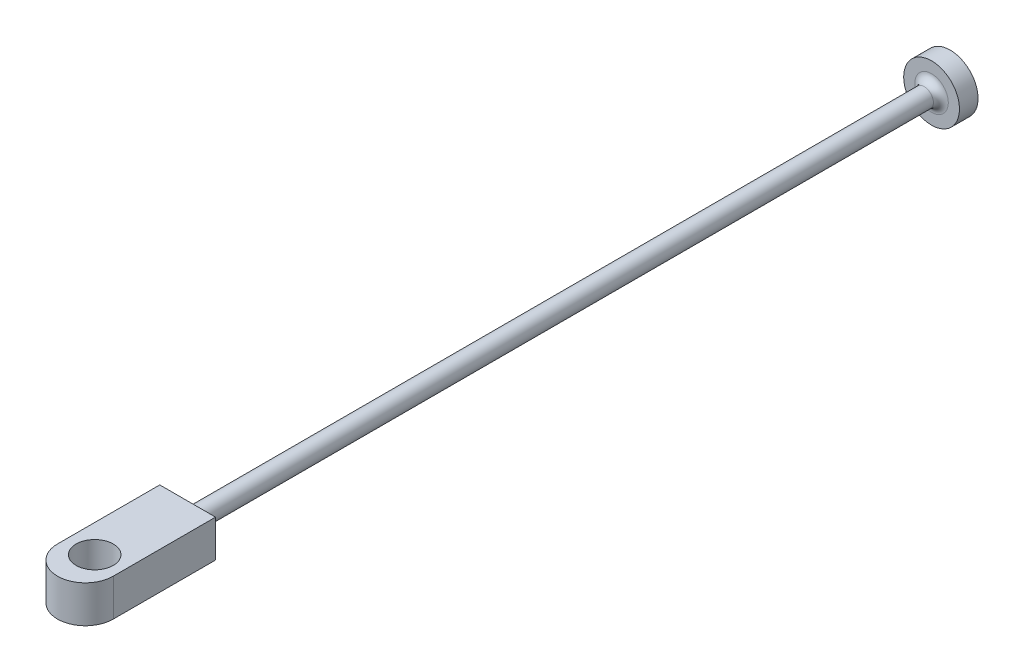
ISO-10303-21;
HEADER;
FILE_DESCRIPTION(('STEP AP214'),'2;1');
FILE_NAME('part.step','',(''),(''),'','','');
FILE_SCHEMA(('AUTOMOTIVE_DESIGN { 1 0 10303 214 1 1 1 1 }'));
ENDSEC;
DATA;
#1=APPLICATION_CONTEXT('core data for automotive mechanical design processes');
#2=APPLICATION_PROTOCOL_DEFINITION('international standard','automotive_design',2000,#1);
#3=PRODUCT_CONTEXT('',#1,'mechanical');
#4=PRODUCT('Part','Part','',(#3));
#5=PRODUCT_RELATED_PRODUCT_CATEGORY('part','',(#4));
#6=PRODUCT_DEFINITION_FORMATION('','',#4);
#7=PRODUCT_DEFINITION_CONTEXT('part definition',#1,'design');
#8=PRODUCT_DEFINITION('design','',#6,#7);
#9=PRODUCT_DEFINITION_SHAPE('','',#8);
#10=(LENGTH_UNIT() NAMED_UNIT(*) SI_UNIT(.MILLI.,.METRE.));
#11=(NAMED_UNIT(*) PLANE_ANGLE_UNIT() SI_UNIT($,.RADIAN.));
#12=(NAMED_UNIT(*) SI_UNIT($,.STERADIAN.) SOLID_ANGLE_UNIT());
#13=UNCERTAINTY_MEASURE_WITH_UNIT(LENGTH_MEASURE(1.E-05),#10,'distance_accuracy_value','');
#14=(GEOMETRIC_REPRESENTATION_CONTEXT(3) GLOBAL_UNCERTAINTY_ASSIGNED_CONTEXT((#13)) GLOBAL_UNIT_ASSIGNED_CONTEXT((#10,
#11,#12)) REPRESENTATION_CONTEXT('',''));
#15=CARTESIAN_POINT('',(0.,0.,0.));
#16=DIRECTION('',(0.,0.,1.));
#17=DIRECTION('',(1.,0.,0.));
#18=AXIS2_PLACEMENT_3D('',#15,#16,#17);
#19=CARTESIAN_POINT('',(50.,-5.,192.5));
#20=DIRECTION('',(0.,-1.,0.));
#21=DIRECTION('',(0.,0.,-1.));
#22=AXIS2_PLACEMENT_3D('',#19,#20,#21);
#23=CYLINDRICAL_SURFACE('',#22,7.5);
#24=DIRECTION('',(0.,1.,0.));
#25=VECTOR('',#24,1.);
#26=CARTESIAN_POINT('',(42.5,-5.,192.5));
#27=LINE('',#26,#25);
#28=CARTESIAN_POINT('',(42.5,-5.,192.5));
#29=VERTEX_POINT('',#28);
#30=CARTESIAN_POINT('',(42.5,5.,192.5));
#31=VERTEX_POINT('',#30);
#32=EDGE_CURVE('E82',#29,#31,#27,.T.);
#33=ORIENTED_EDGE('',*,*,#32,.F.);
#34=CARTESIAN_POINT('',(50.,-5.,192.5));
#35=DIRECTION('',(0.,1.,0.));
#36=DIRECTION('',(0.,0.,1.));
#37=AXIS2_PLACEMENT_3D('',#34,#35,#36);
#38=CIRCLE('',#37,7.5);
#39=CARTESIAN_POINT('',(57.5,-5.,192.5));
#40=VERTEX_POINT('',#39);
#41=EDGE_CURVE('E50',#40,#29,#38,.F.);
#42=ORIENTED_EDGE('',*,*,#41,.F.);
#43=DIRECTION('',(0.,1.,0.));
#44=VECTOR('',#43,1.);
#45=CARTESIAN_POINT('',(57.5,-5.,192.5));
#46=LINE('',#45,#44);
#47=CARTESIAN_POINT('',(57.5,5.,192.5));
#48=VERTEX_POINT('',#47);
#49=EDGE_CURVE('E113',#48,#40,#46,.F.);
#50=ORIENTED_EDGE('',*,*,#49,.F.);
#51=CARTESIAN_POINT('',(50.,5.,192.5));
#52=DIRECTION('',(0.,-1.,0.));
#53=DIRECTION('',(0.,0.,-1.));
#54=AXIS2_PLACEMENT_3D('',#51,#52,#53);
#55=CIRCLE('',#54,7.5);
#56=EDGE_CURVE('E58',#31,#48,#55,.F.);
#57=ORIENTED_EDGE('',*,*,#56,.F.);
#58=EDGE_LOOP('',(#33,#42,#50,#57));
#59=FACE_BOUND('',#58,.T.);
#60=ADVANCED_FACE('F35',(#59),#23,.T.);
#61=CARTESIAN_POINT('',(50.,0.,-35.));
#62=DIRECTION('',(0.,0.,1.));
#63=DIRECTION('',(1.,0.,0.));
#64=AXIS2_PLACEMENT_3D('',#61,#62,#63);
#65=CYLINDRICAL_SURFACE('',#64,2.5);
#66=CARTESIAN_POINT('',(50.,0.,-33.));
#67=DIRECTION('',(0.,0.,-1.));
#68=DIRECTION('',(-1.,0.,0.));
#69=AXIS2_PLACEMENT_3D('',#66,#67,#68);
#70=CIRCLE('',#69,2.5);
#71=CARTESIAN_POINT('',(47.5,0.,-33.));
#72=VERTEX_POINT('',#71);
#73=EDGE_CURVE('E43',#72,#72,#70,.F.);
#74=ORIENTED_EDGE('',*,*,#73,.T.);
#75=EDGE_LOOP('',(#74));
#76=FACE_BOUND('',#75,.T.);
#77=CARTESIAN_POINT('',(50.,0.,163.));
#78=DIRECTION('',(0.,0.,1.));
#79=DIRECTION('',(1.,0.,0.));
#80=AXIS2_PLACEMENT_3D('',#77,#78,#79);
#81=CIRCLE('',#80,2.5);
#82=CARTESIAN_POINT('',(52.5,0.,163.));
#83=VERTEX_POINT('',#82);
#84=EDGE_CURVE('E120',#83,#83,#81,.F.);
#85=ORIENTED_EDGE('',*,*,#84,.T.);
#86=EDGE_LOOP('',(#85));
#87=FACE_BOUND('',#86,.T.);
#88=ADVANCED_FACE('F125',(#76,#87),#65,.T.);
#89=CARTESIAN_POINT('',(57.5,5.,200.));
#90=DIRECTION('',(-1.,0.,0.));
#91=DIRECTION('',(0.,0.,1.));
#92=AXIS2_PLACEMENT_3D('',#89,#90,#91);
#93=PLANE('',#92);
#94=DIRECTION('',(0.,0.,-1.));
#95=VECTOR('',#94,1.);
#96=CARTESIAN_POINT('',(57.5,5.,200.));
#97=LINE('',#96,#95);
#98=CARTESIAN_POINT('',(57.5,5.,165.));
#99=VERTEX_POINT('',#98);
#100=EDGE_CURVE('E75',#48,#99,#97,.T.);
#101=ORIENTED_EDGE('',*,*,#100,.F.);
#102=ORIENTED_EDGE('',*,*,#49,.T.);
#103=DIRECTION('',(0.,0.,-1.));
#104=VECTOR('',#103,1.);
#105=CARTESIAN_POINT('',(57.5,-5.,200.));
#106=LINE('',#105,#104);
#107=CARTESIAN_POINT('',(57.5,-5.,165.));
#108=VERTEX_POINT('',#107);
#109=EDGE_CURVE('E95',#40,#108,#106,.T.);
#110=ORIENTED_EDGE('',*,*,#109,.T.);
#111=DIRECTION('',(0.,1.,0.));
#112=VECTOR('',#111,1.);
#113=CARTESIAN_POINT('',(57.5,5.,165.));
#114=LINE('',#113,#112);
#115=EDGE_CURVE('E89',#108,#99,#114,.T.);
#116=ORIENTED_EDGE('',*,*,#115,.T.);
#117=EDGE_LOOP('',(#101,#102,#110,#116));
#118=FACE_BOUND('',#117,.T.);
#119=ADVANCED_FACE('F93',(#118),#93,.F.);
#120=CARTESIAN_POINT('',(42.5,5.,200.));
#121=DIRECTION('',(0.,-1.,0.));
#122=DIRECTION('',(0.,0.,-1.));
#123=AXIS2_PLACEMENT_3D('',#120,#121,#122);
#124=PLANE('',#123);
#125=CARTESIAN_POINT('',(50.,5.,190.));
#126=DIRECTION('',(0.,1.,0.));
#127=DIRECTION('',(0.,0.,1.));
#128=AXIS2_PLACEMENT_3D('',#125,#126,#127);
#129=CIRCLE('',#128,5.);
#130=CARTESIAN_POINT('',(50.,5.,195.));
#131=VERTEX_POINT('',#130);
#132=EDGE_CURVE('E100',#131,#131,#129,.T.);
#133=ORIENTED_EDGE('',*,*,#132,.F.);
#134=EDGE_LOOP('',(#133));
#135=FACE_BOUND('',#134,.T.);
#136=DIRECTION('',(0.,0.,-1.));
#137=VECTOR('',#136,1.);
#138=CARTESIAN_POINT('',(42.5,5.,200.));
#139=LINE('',#138,#137);
#140=CARTESIAN_POINT('',(42.5,5.,165.));
#141=VERTEX_POINT('',#140);
#142=EDGE_CURVE('E83',#31,#141,#139,.T.);
#143=ORIENTED_EDGE('',*,*,#142,.F.);
#144=ORIENTED_EDGE('',*,*,#56,.T.);
#145=ORIENTED_EDGE('',*,*,#100,.T.);
#146=DIRECTION('',(-1.,0.,0.));
#147=VECTOR('',#146,1.);
#148=CARTESIAN_POINT('',(42.5,5.,165.));
#149=LINE('',#148,#147);
#150=EDGE_CURVE('E78',#99,#141,#149,.T.);
#151=ORIENTED_EDGE('',*,*,#150,.T.);
#152=EDGE_LOOP('',(#143,#144,#145,#151));
#153=FACE_BOUND('',#152,.T.);
#154=ADVANCED_FACE('F77',(#135,#153),#124,.F.);
#155=CARTESIAN_POINT('',(42.5,5.,200.));
#156=DIRECTION('',(1.,0.,0.));
#157=DIRECTION('',(0.,0.,-1.));
#158=AXIS2_PLACEMENT_3D('',#155,#156,#157);
#159=PLANE('',#158);
#160=DIRECTION('',(0.,0.,-1.));
#161=VECTOR('',#160,1.);
#162=CARTESIAN_POINT('',(42.5,-5.,200.));
#163=LINE('',#162,#161);
#164=CARTESIAN_POINT('',(42.5,-5.,165.));
#165=VERTEX_POINT('',#164);
#166=EDGE_CURVE('E108',#29,#165,#163,.T.);
#167=ORIENTED_EDGE('',*,*,#166,.F.);
#168=ORIENTED_EDGE('',*,*,#32,.T.);
#169=ORIENTED_EDGE('',*,*,#142,.T.);
#170=DIRECTION('',(0.,-1.,0.));
#171=VECTOR('',#170,1.);
#172=CARTESIAN_POINT('',(42.5,5.,165.));
#173=LINE('',#172,#171);
#174=EDGE_CURVE('E91',#141,#165,#173,.T.);
#175=ORIENTED_EDGE('',*,*,#174,.T.);
#176=EDGE_LOOP('',(#167,#168,#169,#175));
#177=FACE_BOUND('',#176,.T.);
#178=ADVANCED_FACE('F171',(#177),#159,.F.);
#179=CARTESIAN_POINT('',(42.5,-5.,200.));
#180=DIRECTION('',(0.,1.,0.));
#181=DIRECTION('',(0.,0.,1.));
#182=AXIS2_PLACEMENT_3D('',#179,#180,#181);
#183=PLANE('',#182);
#184=CARTESIAN_POINT('',(50.,-5.,190.));
#185=DIRECTION('',(0.,1.,0.));
#186=DIRECTION('',(0.,0.,1.));
#187=AXIS2_PLACEMENT_3D('',#184,#185,#186);
#188=CIRCLE('',#187,5.);
#189=CARTESIAN_POINT('',(50.,-5.,195.));
#190=VERTEX_POINT('',#189);
#191=EDGE_CURVE('E97',#190,#190,#188,.T.);
#192=ORIENTED_EDGE('',*,*,#191,.T.);
#193=EDGE_LOOP('',(#192));
#194=FACE_BOUND('',#193,.T.);
#195=ORIENTED_EDGE('',*,*,#109,.F.);
#196=ORIENTED_EDGE('',*,*,#41,.T.);
#197=ORIENTED_EDGE('',*,*,#166,.T.);
#198=DIRECTION('',(1.,0.,0.));
#199=VECTOR('',#198,1.);
#200=CARTESIAN_POINT('',(42.5,-5.,165.));
#201=LINE('',#200,#199);
#202=EDGE_CURVE('E105',#165,#108,#201,.T.);
#203=ORIENTED_EDGE('',*,*,#202,.T.);
#204=EDGE_LOOP('',(#195,#196,#197,#203));
#205=FACE_BOUND('',#204,.T.);
#206=ADVANCED_FACE('F166',(#194,#205),#183,.F.);
#207=CARTESIAN_POINT('',(0.,0.,165.));
#208=DIRECTION('',(0.,0.,1.));
#209=DIRECTION('',(1.,0.,0.));
#210=AXIS2_PLACEMENT_3D('',#207,#208,#209);
#211=PLANE('',#210);
#212=CARTESIAN_POINT('',(50.,0.,165.));
#213=DIRECTION('',(0.,0.,1.));
#214=DIRECTION('',(1.,0.,0.));
#215=AXIS2_PLACEMENT_3D('',#212,#213,#214);
#216=CIRCLE('',#215,4.5);
#217=CARTESIAN_POINT('',(54.5,0.,165.));
#218=VERTEX_POINT('',#217);
#219=EDGE_CURVE('E117',#218,#218,#216,.T.);
#220=ORIENTED_EDGE('',*,*,#219,.T.);
#221=EDGE_LOOP('',(#220));
#222=FACE_BOUND('',#221,.T.);
#223=ORIENTED_EDGE('',*,*,#115,.F.);
#224=ORIENTED_EDGE('',*,*,#202,.F.);
#225=ORIENTED_EDGE('',*,*,#174,.F.);
#226=ORIENTED_EDGE('',*,*,#150,.F.);
#227=EDGE_LOOP('',(#223,#224,#225,#226));
#228=FACE_BOUND('',#227,.T.);
#229=ADVANCED_FACE('F87',(#222,#228),#211,.F.);
#230=CARTESIAN_POINT('',(50.,-5.,190.));
#231=DIRECTION('',(0.,1.,0.));
#232=DIRECTION('',(0.,0.,1.));
#233=AXIS2_PLACEMENT_3D('',#230,#231,#232);
#234=CYLINDRICAL_SURFACE('',#233,5.);
#235=ORIENTED_EDGE('',*,*,#191,.F.);
#236=EDGE_LOOP('',(#235));
#237=FACE_BOUND('',#236,.T.);
#238=ORIENTED_EDGE('',*,*,#132,.T.);
#239=EDGE_LOOP('',(#238));
#240=FACE_BOUND('',#239,.T.);
#241=ADVANCED_FACE('F151',(#237,#240),#234,.F.);
#242=CARTESIAN_POINT('',(50.,0.,163.));
#243=DIRECTION('',(0.,0.,1.));
#244=DIRECTION('',(1.,0.,0.));
#245=AXIS2_PLACEMENT_3D('',#242,#243,#244);
#246=TOROIDAL_SURFACE('',#245,4.5,2.);
#247=ORIENTED_EDGE('',*,*,#84,.F.);
#248=EDGE_LOOP('',(#247));
#249=FACE_BOUND('',#248,.T.);
#250=ORIENTED_EDGE('',*,*,#219,.F.);
#251=EDGE_LOOP('',(#250));
#252=FACE_BOUND('',#251,.T.);
#253=ADVANCED_FACE('F148',(#249,#252),#246,.F.);
#254=CARTESIAN_POINT('',(50.,0.,-40.));
#255=DIRECTION('',(0.,0.,1.));
#256=DIRECTION('',(1.,0.,0.));
#257=AXIS2_PLACEMENT_3D('',#254,#255,#256);
#258=CYLINDRICAL_SURFACE('',#257,7.5);
#259=CARTESIAN_POINT('',(50.,0.,-40.));
#260=DIRECTION('',(0.,0.,-1.));
#261=DIRECTION('',(-1.,0.,0.));
#262=AXIS2_PLACEMENT_3D('',#259,#260,#261);
#263=CIRCLE('',#262,7.5);
#264=CARTESIAN_POINT('',(42.5,0.,-40.));
#265=VERTEX_POINT('',#264);
#266=EDGE_CURVE('E248',#265,#265,#263,.T.);
#267=ORIENTED_EDGE('',*,*,#266,.F.);
#268=EDGE_LOOP('',(#267));
#269=FACE_BOUND('',#268,.T.);
#270=CARTESIAN_POINT('',(50.,0.,-35.));
#271=DIRECTION('',(0.,0.,-1.));
#272=DIRECTION('',(-1.,0.,0.));
#273=AXIS2_PLACEMENT_3D('',#270,#271,#272);
#274=CIRCLE('',#273,7.5);
#275=CARTESIAN_POINT('',(42.5,0.,-35.));
#276=VERTEX_POINT('',#275);
#277=EDGE_CURVE('E249',#276,#276,#274,.T.);
#278=ORIENTED_EDGE('',*,*,#277,.T.);
#279=EDGE_LOOP('',(#278));
#280=FACE_BOUND('',#279,.T.);
#281=ADVANCED_FACE('F150',(#269,#280),#258,.T.);
#282=CARTESIAN_POINT('',(50.,0.,-40.));
#283=DIRECTION('',(0.,0.,-1.));
#284=DIRECTION('',(-1.,0.,0.));
#285=AXIS2_PLACEMENT_3D('',#282,#283,#284);
#286=PLANE('',#285);
#287=ORIENTED_EDGE('',*,*,#266,.T.);
#288=EDGE_LOOP('',(#287));
#289=FACE_BOUND('',#288,.T.);
#290=ADVANCED_FACE('F134',(#289),#286,.T.);
#291=CARTESIAN_POINT('',(50.,0.,-35.));
#292=DIRECTION('',(0.,0.,-1.));
#293=DIRECTION('',(-1.,0.,0.));
#294=AXIS2_PLACEMENT_3D('',#291,#292,#293);
#295=PLANE('',#294);
#296=CARTESIAN_POINT('',(50.,0.,-35.));
#297=DIRECTION('',(0.,0.,-1.));
#298=DIRECTION('',(-1.,0.,0.));
#299=AXIS2_PLACEMENT_3D('',#296,#297,#298);
#300=CIRCLE('',#299,4.5);
#301=CARTESIAN_POINT('',(45.5,0.,-35.));
#302=VERTEX_POINT('',#301);
#303=EDGE_CURVE('E11',#302,#302,#300,.T.);
#304=ORIENTED_EDGE('',*,*,#303,.T.);
#305=EDGE_LOOP('',(#304));
#306=FACE_BOUND('',#305,.T.);
#307=ORIENTED_EDGE('',*,*,#277,.F.);
#308=EDGE_LOOP('',(#307));
#309=FACE_BOUND('',#308,.T.);
#310=ADVANCED_FACE('F129',(#306,#309),#295,.F.);
#311=CARTESIAN_POINT('',(50.,0.,-33.));
#312=DIRECTION('',(0.,0.,-1.));
#313=DIRECTION('',(-1.,0.,0.));
#314=AXIS2_PLACEMENT_3D('',#311,#312,#313);
#315=TOROIDAL_SURFACE('',#314,4.5,2.);
#316=ORIENTED_EDGE('',*,*,#303,.F.);
#317=EDGE_LOOP('',(#316));
#318=FACE_BOUND('',#317,.T.);
#319=ORIENTED_EDGE('',*,*,#73,.F.);
#320=EDGE_LOOP('',(#319));
#321=FACE_BOUND('',#320,.T.);
#322=ADVANCED_FACE('F37',(#318,#321),#315,.F.);
#323=CLOSED_SHELL('',(#60,#88,#119,#154,#178,#206,#229,#241,#253,#281,#290,#310,#322));
#324=MANIFOLD_SOLID_BREP('B2',#323);
#325=ADVANCED_BREP_SHAPE_REPRESENTATION('',(#18,#324),#14);
#326=SHAPE_DEFINITION_REPRESENTATION(#9,#325);
ENDSEC;
END-ISO-10303-21;
